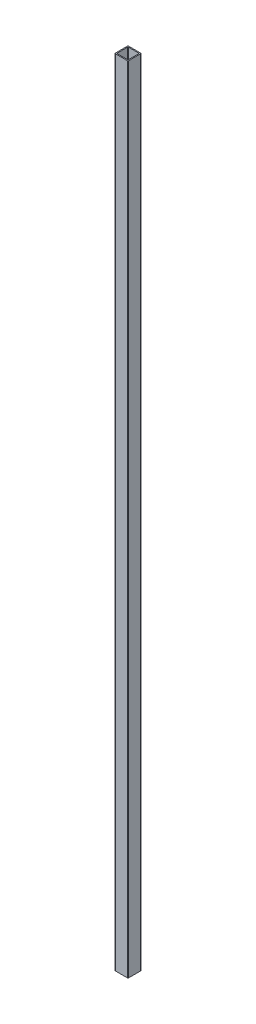
ISO-10303-21;
HEADER;
FILE_DESCRIPTION(('STEP AP214'),'2;1');
FILE_NAME('part.step','',(''),(''),'','','');
FILE_SCHEMA(('AUTOMOTIVE_DESIGN { 1 0 10303 214 1 1 1 1 }'));
ENDSEC;
DATA;
#1=APPLICATION_CONTEXT('core data for automotive mechanical design processes');
#2=APPLICATION_PROTOCOL_DEFINITION('international standard','automotive_design',2000,#1);
#3=PRODUCT_CONTEXT('',#1,'mechanical');
#4=PRODUCT('Part','Part','',(#3));
#5=PRODUCT_RELATED_PRODUCT_CATEGORY('part','',(#4));
#6=PRODUCT_DEFINITION_FORMATION('','',#4);
#7=PRODUCT_DEFINITION_CONTEXT('part definition',#1,'design');
#8=PRODUCT_DEFINITION('design','',#6,#7);
#9=PRODUCT_DEFINITION_SHAPE('','',#8);
#10=(LENGTH_UNIT() NAMED_UNIT(*) SI_UNIT(.MILLI.,.METRE.));
#11=(NAMED_UNIT(*) PLANE_ANGLE_UNIT() SI_UNIT($,.RADIAN.));
#12=(NAMED_UNIT(*) SI_UNIT($,.STERADIAN.) SOLID_ANGLE_UNIT());
#13=UNCERTAINTY_MEASURE_WITH_UNIT(LENGTH_MEASURE(1.E-05),#10,'distance_accuracy_value','');
#14=(GEOMETRIC_REPRESENTATION_CONTEXT(3) GLOBAL_UNCERTAINTY_ASSIGNED_CONTEXT((#13)) GLOBAL_UNIT_ASSIGNED_CONTEXT((#10,
#11,#12)) REPRESENTATION_CONTEXT('',''));
#15=CARTESIAN_POINT('',(0.,0.,0.));
#16=DIRECTION('',(0.,0.,1.));
#17=DIRECTION('',(1.,0.,0.));
#18=AXIS2_PLACEMENT_3D('',#15,#16,#17);
#19=CARTESIAN_POINT('',(-9.,1200.,9.));
#20=DIRECTION('',(0.,-1.,0.));
#21=DIRECTION('',(0.,0.,-1.));
#22=AXIS2_PLACEMENT_3D('',#19,#20,#21);
#23=PLANE('',#22);
#24=CARTESIAN_POINT('',(-9.,1200.,9.));
#25=DIRECTION('',(0.,1.,0.));
#26=DIRECTION('',(0.,0.,-1.));
#27=AXIS2_PLACEMENT_3D('',#24,#25,#26);
#28=CIRCLE('',#27,0.999999999999999);
#29=CARTESIAN_POINT('',(-10.,1200.,8.99999999999999));
#30=VERTEX_POINT('',#29);
#31=CARTESIAN_POINT('',(-8.99999999999999,1200.,10.));
#32=VERTEX_POINT('',#31);
#33=EDGE_CURVE('E213',#30,#32,#28,.T.);
#34=ORIENTED_EDGE('',*,*,#33,.T.);
#35=DIRECTION('',(1.,0.,0.));
#36=VECTOR('',#35,1.);
#37=CARTESIAN_POINT('',(-8.99999999999999,1200.,10.));
#38=LINE('',#37,#36);
#39=CARTESIAN_POINT('',(8.99999999999999,1200.,10.));
#40=VERTEX_POINT('',#39);
#41=EDGE_CURVE('E216',#32,#40,#38,.T.);
#42=ORIENTED_EDGE('',*,*,#41,.T.);
#43=CARTESIAN_POINT('',(9.,1200.,9.));
#44=DIRECTION('',(0.,1.,0.));
#45=DIRECTION('',(0.,0.,1.));
#46=AXIS2_PLACEMENT_3D('',#43,#44,#45);
#47=CIRCLE('',#46,0.999999999999999);
#48=CARTESIAN_POINT('',(10.,1200.,8.99999999999999));
#49=VERTEX_POINT('',#48);
#50=EDGE_CURVE('E219',#40,#49,#47,.T.);
#51=ORIENTED_EDGE('',*,*,#50,.T.);
#52=DIRECTION('',(0.,0.,-1.));
#53=VECTOR('',#52,1.);
#54=CARTESIAN_POINT('',(10.,1200.,8.99999999999999));
#55=LINE('',#54,#53);
#56=CARTESIAN_POINT('',(10.,1200.,-8.99999999999999));
#57=VERTEX_POINT('',#56);
#58=EDGE_CURVE('E221',#49,#57,#55,.T.);
#59=ORIENTED_EDGE('',*,*,#58,.T.);
#60=CARTESIAN_POINT('',(9.,1200.,-9.));
#61=DIRECTION('',(0.,1.,0.));
#62=DIRECTION('',(0.,0.,-1.));
#63=AXIS2_PLACEMENT_3D('',#60,#61,#62);
#64=CIRCLE('',#63,0.999999999999999);
#65=CARTESIAN_POINT('',(8.99999999999999,1200.,-10.));
#66=VERTEX_POINT('',#65);
#67=EDGE_CURVE('E223',#57,#66,#64,.T.);
#68=ORIENTED_EDGE('',*,*,#67,.T.);
#69=DIRECTION('',(-1.,0.,0.));
#70=VECTOR('',#69,1.);
#71=CARTESIAN_POINT('',(-8.99999999999999,1200.,-10.));
#72=LINE('',#71,#70);
#73=CARTESIAN_POINT('',(-8.99999999999999,1200.,-10.));
#74=VERTEX_POINT('',#73);
#75=EDGE_CURVE('E225',#66,#74,#72,.T.);
#76=ORIENTED_EDGE('',*,*,#75,.T.);
#77=CARTESIAN_POINT('',(-9.,1200.,-9.));
#78=DIRECTION('',(0.,1.,0.));
#79=DIRECTION('',(0.,0.,-1.));
#80=AXIS2_PLACEMENT_3D('',#77,#78,#79);
#81=CIRCLE('',#80,0.999999999999999);
#82=CARTESIAN_POINT('',(-10.,1200.,-8.99999999999999));
#83=VERTEX_POINT('',#82);
#84=EDGE_CURVE('E227',#74,#83,#81,.T.);
#85=ORIENTED_EDGE('',*,*,#84,.T.);
#86=DIRECTION('',(0.,0.,1.));
#87=VECTOR('',#86,1.);
#88=CARTESIAN_POINT('',(-10.,1200.,8.99999999999999));
#89=LINE('',#88,#87);
#90=EDGE_CURVE('E229',#83,#30,#89,.T.);
#91=ORIENTED_EDGE('',*,*,#90,.T.);
#92=EDGE_LOOP('',(#34,#42,#51,#59,#68,#76,#85,#91));
#93=FACE_BOUND('',#92,.T.);
#94=CARTESIAN_POINT('',(-7.5,1200.,7.5));
#95=DIRECTION('',(0.,1.,0.));
#96=DIRECTION('',(0.,0.,-1.));
#97=AXIS2_PLACEMENT_3D('',#94,#95,#96);
#98=CIRCLE('',#97,1.);
#99=CARTESIAN_POINT('',(-8.5,1200.,7.49999999999999));
#100=VERTEX_POINT('',#99);
#101=CARTESIAN_POINT('',(-7.5,1200.,8.5));
#102=VERTEX_POINT('',#101);
#103=EDGE_CURVE('E148',#100,#102,#98,.T.);
#104=ORIENTED_EDGE('',*,*,#103,.F.);
#105=DIRECTION('',(0.,0.,1.));
#106=VECTOR('',#105,1.);
#107=CARTESIAN_POINT('',(-8.5,1200.,7.49999999999999));
#108=LINE('',#107,#106);
#109=CARTESIAN_POINT('',(-8.5,1200.,-7.49999999999999));
#110=VERTEX_POINT('',#109);
#111=EDGE_CURVE('E181',#110,#100,#108,.T.);
#112=ORIENTED_EDGE('',*,*,#111,.F.);
#113=CARTESIAN_POINT('',(-7.5,1200.,-7.5));
#114=DIRECTION('',(0.,1.,0.));
#115=DIRECTION('',(0.,0.,-1.));
#116=AXIS2_PLACEMENT_3D('',#113,#114,#115);
#117=CIRCLE('',#116,1.);
#118=CARTESIAN_POINT('',(-7.5,1200.,-8.5));
#119=VERTEX_POINT('',#118);
#120=EDGE_CURVE('E179',#119,#110,#117,.T.);
#121=ORIENTED_EDGE('',*,*,#120,.F.);
#122=DIRECTION('',(-1.,0.,0.));
#123=VECTOR('',#122,1.);
#124=CARTESIAN_POINT('',(-7.5,1200.,-8.5));
#125=LINE('',#124,#123);
#126=CARTESIAN_POINT('',(7.49999999999999,1200.,-8.5));
#127=VERTEX_POINT('',#126);
#128=EDGE_CURVE('E177',#127,#119,#125,.T.);
#129=ORIENTED_EDGE('',*,*,#128,.F.);
#130=CARTESIAN_POINT('',(7.5,1200.,-7.5));
#131=DIRECTION('',(0.,1.,0.));
#132=DIRECTION('',(0.,0.,-1.));
#133=AXIS2_PLACEMENT_3D('',#130,#131,#132);
#134=CIRCLE('',#133,1.);
#135=CARTESIAN_POINT('',(8.5,1200.,-7.49999999999999));
#136=VERTEX_POINT('',#135);
#137=EDGE_CURVE('E175',#136,#127,#134,.T.);
#138=ORIENTED_EDGE('',*,*,#137,.F.);
#139=DIRECTION('',(0.,0.,-1.));
#140=VECTOR('',#139,1.);
#141=CARTESIAN_POINT('',(8.5,1200.,7.49999999999999));
#142=LINE('',#141,#140);
#143=CARTESIAN_POINT('',(8.5,1200.,7.49999999999999));
#144=VERTEX_POINT('',#143);
#145=EDGE_CURVE('E171',#144,#136,#142,.T.);
#146=ORIENTED_EDGE('',*,*,#145,.F.);
#147=CARTESIAN_POINT('',(7.5,1200.,7.5));
#148=DIRECTION('',(0.,1.,0.));
#149=DIRECTION('',(0.,0.,1.));
#150=AXIS2_PLACEMENT_3D('',#147,#148,#149);
#151=CIRCLE('',#150,1.);
#152=CARTESIAN_POINT('',(7.49999999999999,1200.,8.5));
#153=VERTEX_POINT('',#152);
#154=EDGE_CURVE('E169',#153,#144,#151,.T.);
#155=ORIENTED_EDGE('',*,*,#154,.F.);
#156=DIRECTION('',(1.,0.,0.));
#157=VECTOR('',#156,1.);
#158=CARTESIAN_POINT('',(-7.5,1200.,8.5));
#159=LINE('',#158,#157);
#160=EDGE_CURVE('E156',#102,#153,#159,.T.);
#161=ORIENTED_EDGE('',*,*,#160,.F.);
#162=EDGE_LOOP('',(#104,#112,#121,#129,#138,#146,#155,#161));
#163=FACE_BOUND('',#162,.T.);
#164=ADVANCED_FACE('F35',(#93,#163),#23,.F.);
#165=CARTESIAN_POINT('',(-9.,0.,9.));
#166=DIRECTION('',(0.,-1.,0.));
#167=DIRECTION('',(0.,0.,-1.));
#168=AXIS2_PLACEMENT_3D('',#165,#166,#167);
#169=PLANE('',#168);
#170=CARTESIAN_POINT('',(-9.,0.,9.));
#171=DIRECTION('',(0.,1.,0.));
#172=DIRECTION('',(0.,0.,-1.));
#173=AXIS2_PLACEMENT_3D('',#170,#171,#172);
#174=CIRCLE('',#173,0.999999999999999);
#175=CARTESIAN_POINT('',(-10.,0.,8.99999999999999));
#176=VERTEX_POINT('',#175);
#177=CARTESIAN_POINT('',(-8.99999999999999,0.,10.));
#178=VERTEX_POINT('',#177);
#179=EDGE_CURVE('E164',#176,#178,#174,.T.);
#180=ORIENTED_EDGE('',*,*,#179,.F.);
#181=DIRECTION('',(0.,0.,1.));
#182=VECTOR('',#181,1.);
#183=CARTESIAN_POINT('',(-10.,0.,8.99999999999999));
#184=LINE('',#183,#182);
#185=CARTESIAN_POINT('',(-10.,0.,-8.99999999999999));
#186=VERTEX_POINT('',#185);
#187=EDGE_CURVE('E217',#186,#176,#184,.T.);
#188=ORIENTED_EDGE('',*,*,#187,.F.);
#189=CARTESIAN_POINT('',(-9.,0.,-9.));
#190=DIRECTION('',(0.,1.,0.));
#191=DIRECTION('',(0.,0.,-1.));
#192=AXIS2_PLACEMENT_3D('',#189,#190,#191);
#193=CIRCLE('',#192,0.999999999999999);
#194=CARTESIAN_POINT('',(-8.99999999999999,0.,-10.));
#195=VERTEX_POINT('',#194);
#196=EDGE_CURVE('E244',#195,#186,#193,.T.);
#197=ORIENTED_EDGE('',*,*,#196,.F.);
#198=DIRECTION('',(-1.,0.,0.));
#199=VECTOR('',#198,1.);
#200=CARTESIAN_POINT('',(-8.99999999999999,0.,-10.));
#201=LINE('',#200,#199);
#202=CARTESIAN_POINT('',(8.99999999999999,0.,-10.));
#203=VERTEX_POINT('',#202);
#204=EDGE_CURVE('E242',#203,#195,#201,.T.);
#205=ORIENTED_EDGE('',*,*,#204,.F.);
#206=CARTESIAN_POINT('',(9.,0.,-9.));
#207=DIRECTION('',(0.,1.,0.));
#208=DIRECTION('',(0.,0.,-1.));
#209=AXIS2_PLACEMENT_3D('',#206,#207,#208);
#210=CIRCLE('',#209,0.999999999999999);
#211=CARTESIAN_POINT('',(10.,0.,-8.99999999999999));
#212=VERTEX_POINT('',#211);
#213=EDGE_CURVE('E240',#212,#203,#210,.T.);
#214=ORIENTED_EDGE('',*,*,#213,.F.);
#215=DIRECTION('',(0.,0.,-1.));
#216=VECTOR('',#215,1.);
#217=CARTESIAN_POINT('',(10.,0.,8.99999999999999));
#218=LINE('',#217,#216);
#219=CARTESIAN_POINT('',(10.,0.,8.99999999999999));
#220=VERTEX_POINT('',#219);
#221=EDGE_CURVE('E238',#220,#212,#218,.T.);
#222=ORIENTED_EDGE('',*,*,#221,.F.);
#223=CARTESIAN_POINT('',(9.,0.,9.));
#224=DIRECTION('',(0.,1.,0.));
#225=DIRECTION('',(0.,0.,1.));
#226=AXIS2_PLACEMENT_3D('',#223,#224,#225);
#227=CIRCLE('',#226,0.999999999999999);
#228=CARTESIAN_POINT('',(8.99999999999999,0.,10.));
#229=VERTEX_POINT('',#228);
#230=EDGE_CURVE('E236',#229,#220,#227,.T.);
#231=ORIENTED_EDGE('',*,*,#230,.F.);
#232=DIRECTION('',(1.,0.,0.));
#233=VECTOR('',#232,1.);
#234=CARTESIAN_POINT('',(-8.99999999999999,0.,10.));
#235=LINE('',#234,#233);
#236=EDGE_CURVE('E234',#178,#229,#235,.T.);
#237=ORIENTED_EDGE('',*,*,#236,.F.);
#238=EDGE_LOOP('',(#180,#188,#197,#205,#214,#222,#231,#237));
#239=FACE_BOUND('',#238,.T.);
#240=DIRECTION('',(0.,0.,1.));
#241=VECTOR('',#240,1.);
#242=CARTESIAN_POINT('',(-8.5,0.,7.49999999999999));
#243=LINE('',#242,#241);
#244=CARTESIAN_POINT('',(-8.5,0.,-7.49999999999999));
#245=VERTEX_POINT('',#244);
#246=CARTESIAN_POINT('',(-8.5,0.,7.49999999999999));
#247=VERTEX_POINT('',#246);
#248=EDGE_CURVE('E157',#245,#247,#243,.T.);
#249=ORIENTED_EDGE('',*,*,#248,.T.);
#250=CARTESIAN_POINT('',(-7.5,0.,7.5));
#251=DIRECTION('',(0.,1.,0.));
#252=DIRECTION('',(0.,0.,-1.));
#253=AXIS2_PLACEMENT_3D('',#250,#251,#252);
#254=CIRCLE('',#253,1.);
#255=CARTESIAN_POINT('',(-7.5,0.,8.5));
#256=VERTEX_POINT('',#255);
#257=EDGE_CURVE('E58',#247,#256,#254,.T.);
#258=ORIENTED_EDGE('',*,*,#257,.T.);
#259=DIRECTION('',(1.,0.,0.));
#260=VECTOR('',#259,1.);
#261=CARTESIAN_POINT('',(-7.5,0.,8.5));
#262=LINE('',#261,#260);
#263=CARTESIAN_POINT('',(7.49999999999999,0.,8.5));
#264=VERTEX_POINT('',#263);
#265=EDGE_CURVE('E163',#256,#264,#262,.T.);
#266=ORIENTED_EDGE('',*,*,#265,.T.);
#267=CARTESIAN_POINT('',(7.5,0.,7.5));
#268=DIRECTION('',(0.,1.,0.));
#269=DIRECTION('',(0.,0.,1.));
#270=AXIS2_PLACEMENT_3D('',#267,#268,#269);
#271=CIRCLE('',#270,1.);
#272=CARTESIAN_POINT('',(8.5,0.,7.49999999999999));
#273=VERTEX_POINT('',#272);
#274=EDGE_CURVE('E185',#264,#273,#271,.T.);
#275=ORIENTED_EDGE('',*,*,#274,.T.);
#276=DIRECTION('',(0.,0.,-1.));
#277=VECTOR('',#276,1.);
#278=CARTESIAN_POINT('',(8.5,0.,7.49999999999999));
#279=LINE('',#278,#277);
#280=CARTESIAN_POINT('',(8.5,0.,-7.49999999999999));
#281=VERTEX_POINT('',#280);
#282=EDGE_CURVE('E188',#273,#281,#279,.T.);
#283=ORIENTED_EDGE('',*,*,#282,.T.);
#284=CARTESIAN_POINT('',(7.5,0.,-7.5));
#285=DIRECTION('',(0.,1.,0.));
#286=DIRECTION('',(0.,0.,-1.));
#287=AXIS2_PLACEMENT_3D('',#284,#285,#286);
#288=CIRCLE('',#287,1.);
#289=CARTESIAN_POINT('',(7.49999999999999,0.,-8.5));
#290=VERTEX_POINT('',#289);
#291=EDGE_CURVE('E191',#281,#290,#288,.T.);
#292=ORIENTED_EDGE('',*,*,#291,.T.);
#293=DIRECTION('',(-1.,0.,0.));
#294=VECTOR('',#293,1.);
#295=CARTESIAN_POINT('',(-7.5,0.,-8.5));
#296=LINE('',#295,#294);
#297=CARTESIAN_POINT('',(-7.5,0.,-8.5));
#298=VERTEX_POINT('',#297);
#299=EDGE_CURVE('E194',#290,#298,#296,.T.);
#300=ORIENTED_EDGE('',*,*,#299,.T.);
#301=CARTESIAN_POINT('',(-7.5,0.,-7.5));
#302=DIRECTION('',(0.,1.,0.));
#303=DIRECTION('',(0.,0.,-1.));
#304=AXIS2_PLACEMENT_3D('',#301,#302,#303);
#305=CIRCLE('',#304,1.);
#306=EDGE_CURVE('E197',#298,#245,#305,.T.);
#307=ORIENTED_EDGE('',*,*,#306,.T.);
#308=EDGE_LOOP('',(#249,#258,#266,#275,#283,#292,#300,#307));
#309=FACE_BOUND('',#308,.T.);
#310=ADVANCED_FACE('F274',(#239,#309),#169,.T.);
#311=CARTESIAN_POINT('',(-9.,1200.,9.));
#312=DIRECTION('',(0.,-1.,0.));
#313=DIRECTION('',(0.,0.,-1.));
#314=AXIS2_PLACEMENT_3D('',#311,#312,#313);
#315=CYLINDRICAL_SURFACE('',#314,0.999999999999999);
#316=ORIENTED_EDGE('',*,*,#179,.T.);
#317=DIRECTION('',(0.,-1.,0.));
#318=VECTOR('',#317,1.);
#319=CARTESIAN_POINT('',(-8.99999999999999,1200.,10.));
#320=LINE('',#319,#318);
#321=EDGE_CURVE('E11',#32,#178,#320,.T.);
#322=ORIENTED_EDGE('',*,*,#321,.F.);
#323=ORIENTED_EDGE('',*,*,#33,.F.);
#324=DIRECTION('',(0.,-1.,0.));
#325=VECTOR('',#324,1.);
#326=CARTESIAN_POINT('',(-10.,1200.,8.99999999999999));
#327=LINE('',#326,#325);
#328=EDGE_CURVE('E231',#30,#176,#327,.T.);
#329=ORIENTED_EDGE('',*,*,#328,.T.);
#330=EDGE_LOOP('',(#316,#322,#323,#329));
#331=FACE_BOUND('',#330,.T.);
#332=ADVANCED_FACE('F37',(#331),#315,.T.);
#333=CARTESIAN_POINT('',(-8.99999999999999,1200.,10.));
#334=DIRECTION('',(0.,0.,-1.));
#335=DIRECTION('',(-1.,0.,0.));
#336=AXIS2_PLACEMENT_3D('',#333,#334,#335);
#337=PLANE('',#336);
#338=ORIENTED_EDGE('',*,*,#236,.T.);
#339=DIRECTION('',(0.,-1.,0.));
#340=VECTOR('',#339,1.);
#341=CARTESIAN_POINT('',(8.99999999999999,1200.,10.));
#342=LINE('',#341,#340);
#343=EDGE_CURVE('E43',#40,#229,#342,.T.);
#344=ORIENTED_EDGE('',*,*,#343,.F.);
#345=ORIENTED_EDGE('',*,*,#41,.F.);
#346=ORIENTED_EDGE('',*,*,#321,.T.);
#347=EDGE_LOOP('',(#338,#344,#345,#346));
#348=FACE_BOUND('',#347,.T.);
#349=ADVANCED_FACE('F291',(#348),#337,.F.);
#350=CARTESIAN_POINT('',(9.,1200.,9.));
#351=DIRECTION('',(0.,-1.,0.));
#352=DIRECTION('',(0.,0.,-1.));
#353=AXIS2_PLACEMENT_3D('',#350,#351,#352);
#354=CYLINDRICAL_SURFACE('',#353,0.999999999999999);
#355=ORIENTED_EDGE('',*,*,#230,.T.);
#356=DIRECTION('',(0.,-1.,0.));
#357=VECTOR('',#356,1.);
#358=CARTESIAN_POINT('',(10.,1200.,8.99999999999999));
#359=LINE('',#358,#357);
#360=EDGE_CURVE('E261',#49,#220,#359,.T.);
#361=ORIENTED_EDGE('',*,*,#360,.F.);
#362=ORIENTED_EDGE('',*,*,#50,.F.);
#363=ORIENTED_EDGE('',*,*,#343,.T.);
#364=EDGE_LOOP('',(#355,#361,#362,#363));
#365=FACE_BOUND('',#364,.T.);
#366=ADVANCED_FACE('F268',(#365),#354,.T.);
#367=CARTESIAN_POINT('',(10.,1200.,8.99999999999999));
#368=DIRECTION('',(-1.,0.,0.));
#369=DIRECTION('',(0.,0.,1.));
#370=AXIS2_PLACEMENT_3D('',#367,#368,#369);
#371=PLANE('',#370);
#372=ORIENTED_EDGE('',*,*,#221,.T.);
#373=DIRECTION('',(0.,-1.,0.));
#374=VECTOR('',#373,1.);
#375=CARTESIAN_POINT('',(10.,1200.,-8.99999999999999));
#376=LINE('',#375,#374);
#377=EDGE_CURVE('E258',#57,#212,#376,.T.);
#378=ORIENTED_EDGE('',*,*,#377,.F.);
#379=ORIENTED_EDGE('',*,*,#58,.F.);
#380=ORIENTED_EDGE('',*,*,#360,.T.);
#381=EDGE_LOOP('',(#372,#378,#379,#380));
#382=FACE_BOUND('',#381,.T.);
#383=ADVANCED_FACE('F280',(#382),#371,.F.);
#384=CARTESIAN_POINT('',(9.,1200.,-9.));
#385=DIRECTION('',(0.,-1.,0.));
#386=DIRECTION('',(0.,0.,-1.));
#387=AXIS2_PLACEMENT_3D('',#384,#385,#386);
#388=CYLINDRICAL_SURFACE('',#387,0.999999999999999);
#389=ORIENTED_EDGE('',*,*,#213,.T.);
#390=DIRECTION('',(0.,-1.,0.));
#391=VECTOR('',#390,1.);
#392=CARTESIAN_POINT('',(8.99999999999999,1200.,-10.));
#393=LINE('',#392,#391);
#394=EDGE_CURVE('E255',#66,#203,#393,.T.);
#395=ORIENTED_EDGE('',*,*,#394,.F.);
#396=ORIENTED_EDGE('',*,*,#67,.F.);
#397=ORIENTED_EDGE('',*,*,#377,.T.);
#398=EDGE_LOOP('',(#389,#395,#396,#397));
#399=FACE_BOUND('',#398,.T.);
#400=ADVANCED_FACE('F284',(#399),#388,.T.);
#401=CARTESIAN_POINT('',(-8.99999999999999,1200.,-10.));
#402=DIRECTION('',(0.,0.,1.));
#403=DIRECTION('',(1.,0.,0.));
#404=AXIS2_PLACEMENT_3D('',#401,#402,#403);
#405=PLANE('',#404);
#406=ORIENTED_EDGE('',*,*,#204,.T.);
#407=DIRECTION('',(0.,-1.,0.));
#408=VECTOR('',#407,1.);
#409=CARTESIAN_POINT('',(-8.99999999999999,1200.,-10.));
#410=LINE('',#409,#408);
#411=EDGE_CURVE('E252',#74,#195,#410,.T.);
#412=ORIENTED_EDGE('',*,*,#411,.F.);
#413=ORIENTED_EDGE('',*,*,#75,.F.);
#414=ORIENTED_EDGE('',*,*,#394,.T.);
#415=EDGE_LOOP('',(#406,#412,#413,#414));
#416=FACE_BOUND('',#415,.T.);
#417=ADVANCED_FACE('F304',(#416),#405,.F.);
#418=CARTESIAN_POINT('',(-9.,1200.,-9.));
#419=DIRECTION('',(0.,-1.,0.));
#420=DIRECTION('',(0.,0.,-1.));
#421=AXIS2_PLACEMENT_3D('',#418,#419,#420);
#422=CYLINDRICAL_SURFACE('',#421,0.999999999999999);
#423=ORIENTED_EDGE('',*,*,#196,.T.);
#424=DIRECTION('',(0.,-1.,0.));
#425=VECTOR('',#424,1.);
#426=CARTESIAN_POINT('',(-10.,1200.,-8.99999999999999));
#427=LINE('',#426,#425);
#428=EDGE_CURVE('E249',#83,#186,#427,.T.);
#429=ORIENTED_EDGE('',*,*,#428,.F.);
#430=ORIENTED_EDGE('',*,*,#84,.F.);
#431=ORIENTED_EDGE('',*,*,#411,.T.);
#432=EDGE_LOOP('',(#423,#429,#430,#431));
#433=FACE_BOUND('',#432,.T.);
#434=ADVANCED_FACE('F302',(#433),#422,.T.);
#435=CARTESIAN_POINT('',(-10.,1200.,8.99999999999999));
#436=DIRECTION('',(1.,0.,0.));
#437=DIRECTION('',(0.,0.,-1.));
#438=AXIS2_PLACEMENT_3D('',#435,#436,#437);
#439=PLANE('',#438);
#440=ORIENTED_EDGE('',*,*,#187,.T.);
#441=ORIENTED_EDGE('',*,*,#328,.F.);
#442=ORIENTED_EDGE('',*,*,#90,.F.);
#443=ORIENTED_EDGE('',*,*,#428,.T.);
#444=EDGE_LOOP('',(#440,#441,#442,#443));
#445=FACE_BOUND('',#444,.T.);
#446=ADVANCED_FACE('F297',(#445),#439,.F.);
#447=CARTESIAN_POINT('',(-7.5,1200.,7.5));
#448=DIRECTION('',(0.,-1.,0.));
#449=DIRECTION('',(0.,0.,-1.));
#450=AXIS2_PLACEMENT_3D('',#447,#448,#449);
#451=CYLINDRICAL_SURFACE('',#450,1.);
#452=ORIENTED_EDGE('',*,*,#257,.F.);
#453=DIRECTION('',(0.,-1.,0.));
#454=VECTOR('',#453,1.);
#455=CARTESIAN_POINT('',(-8.5,1200.,7.49999999999999));
#456=LINE('',#455,#454);
#457=EDGE_CURVE('E152',#100,#247,#456,.T.);
#458=ORIENTED_EDGE('',*,*,#457,.F.);
#459=ORIENTED_EDGE('',*,*,#103,.T.);
#460=DIRECTION('',(0.,-1.,0.));
#461=VECTOR('',#460,1.);
#462=CARTESIAN_POINT('',(-7.5,1200.,8.5));
#463=LINE('',#462,#461);
#464=EDGE_CURVE('E151',#102,#256,#463,.T.);
#465=ORIENTED_EDGE('',*,*,#464,.T.);
#466=EDGE_LOOP('',(#452,#458,#459,#465));
#467=FACE_BOUND('',#466,.T.);
#468=ADVANCED_FACE('F150',(#467),#451,.F.);
#469=CARTESIAN_POINT('',(-7.5,1200.,8.5));
#470=DIRECTION('',(0.,0.,-1.));
#471=DIRECTION('',(-1.,0.,0.));
#472=AXIS2_PLACEMENT_3D('',#469,#470,#471);
#473=PLANE('',#472);
#474=ORIENTED_EDGE('',*,*,#265,.F.);
#475=ORIENTED_EDGE('',*,*,#464,.F.);
#476=ORIENTED_EDGE('',*,*,#160,.T.);
#477=DIRECTION('',(0.,-1.,0.));
#478=VECTOR('',#477,1.);
#479=CARTESIAN_POINT('',(7.49999999999999,1200.,8.5));
#480=LINE('',#479,#478);
#481=EDGE_CURVE('E165',#153,#264,#480,.T.);
#482=ORIENTED_EDGE('',*,*,#481,.T.);
#483=EDGE_LOOP('',(#474,#475,#476,#482));
#484=FACE_BOUND('',#483,.T.);
#485=ADVANCED_FACE('F160',(#484),#473,.T.);
#486=CARTESIAN_POINT('',(7.5,1200.,7.5));
#487=DIRECTION('',(0.,-1.,0.));
#488=DIRECTION('',(0.,0.,-1.));
#489=AXIS2_PLACEMENT_3D('',#486,#487,#488);
#490=CYLINDRICAL_SURFACE('',#489,1.);
#491=ORIENTED_EDGE('',*,*,#274,.F.);
#492=ORIENTED_EDGE('',*,*,#481,.F.);
#493=ORIENTED_EDGE('',*,*,#154,.T.);
#494=DIRECTION('',(0.,-1.,0.));
#495=VECTOR('',#494,1.);
#496=CARTESIAN_POINT('',(8.5,1200.,7.49999999999999));
#497=LINE('',#496,#495);
#498=EDGE_CURVE('E210',#144,#273,#497,.T.);
#499=ORIENTED_EDGE('',*,*,#498,.T.);
#500=EDGE_LOOP('',(#491,#492,#493,#499));
#501=FACE_BOUND('',#500,.T.);
#502=ADVANCED_FACE('F329',(#501),#490,.F.);
#503=CARTESIAN_POINT('',(8.5,1200.,7.49999999999999));
#504=DIRECTION('',(-1.,0.,0.));
#505=DIRECTION('',(0.,0.,1.));
#506=AXIS2_PLACEMENT_3D('',#503,#504,#505);
#507=PLANE('',#506);
#508=ORIENTED_EDGE('',*,*,#282,.F.);
#509=ORIENTED_EDGE('',*,*,#498,.F.);
#510=ORIENTED_EDGE('',*,*,#145,.T.);
#511=DIRECTION('',(0.,-1.,0.));
#512=VECTOR('',#511,1.);
#513=CARTESIAN_POINT('',(8.5,1200.,-7.49999999999999));
#514=LINE('',#513,#512);
#515=EDGE_CURVE('E208',#136,#281,#514,.T.);
#516=ORIENTED_EDGE('',*,*,#515,.T.);
#517=EDGE_LOOP('',(#508,#509,#510,#516));
#518=FACE_BOUND('',#517,.T.);
#519=ADVANCED_FACE('F333',(#518),#507,.T.);
#520=CARTESIAN_POINT('',(7.5,1200.,-7.5));
#521=DIRECTION('',(0.,-1.,0.));
#522=DIRECTION('',(0.,0.,-1.));
#523=AXIS2_PLACEMENT_3D('',#520,#521,#522);
#524=CYLINDRICAL_SURFACE('',#523,1.);
#525=ORIENTED_EDGE('',*,*,#291,.F.);
#526=ORIENTED_EDGE('',*,*,#515,.F.);
#527=ORIENTED_EDGE('',*,*,#137,.T.);
#528=DIRECTION('',(0.,-1.,0.));
#529=VECTOR('',#528,1.);
#530=CARTESIAN_POINT('',(7.49999999999999,1200.,-8.5));
#531=LINE('',#530,#529);
#532=EDGE_CURVE('E206',#127,#290,#531,.T.);
#533=ORIENTED_EDGE('',*,*,#532,.T.);
#534=EDGE_LOOP('',(#525,#526,#527,#533));
#535=FACE_BOUND('',#534,.T.);
#536=ADVANCED_FACE('F339',(#535),#524,.F.);
#537=CARTESIAN_POINT('',(-7.5,1200.,-8.5));
#538=DIRECTION('',(0.,0.,1.));
#539=DIRECTION('',(1.,0.,0.));
#540=AXIS2_PLACEMENT_3D('',#537,#538,#539);
#541=PLANE('',#540);
#542=ORIENTED_EDGE('',*,*,#299,.F.);
#543=ORIENTED_EDGE('',*,*,#532,.F.);
#544=ORIENTED_EDGE('',*,*,#128,.T.);
#545=DIRECTION('',(0.,-1.,0.));
#546=VECTOR('',#545,1.);
#547=CARTESIAN_POINT('',(-7.5,1200.,-8.5));
#548=LINE('',#547,#546);
#549=EDGE_CURVE('E204',#119,#298,#548,.T.);
#550=ORIENTED_EDGE('',*,*,#549,.T.);
#551=EDGE_LOOP('',(#542,#543,#544,#550));
#552=FACE_BOUND('',#551,.T.);
#553=ADVANCED_FACE('F343',(#552),#541,.T.);
#554=CARTESIAN_POINT('',(-7.5,1200.,-7.5));
#555=DIRECTION('',(0.,-1.,0.));
#556=DIRECTION('',(0.,0.,-1.));
#557=AXIS2_PLACEMENT_3D('',#554,#555,#556);
#558=CYLINDRICAL_SURFACE('',#557,1.);
#559=ORIENTED_EDGE('',*,*,#306,.F.);
#560=ORIENTED_EDGE('',*,*,#549,.F.);
#561=ORIENTED_EDGE('',*,*,#120,.T.);
#562=DIRECTION('',(0.,-1.,0.));
#563=VECTOR('',#562,1.);
#564=CARTESIAN_POINT('',(-8.5,1200.,-7.49999999999999));
#565=LINE('',#564,#563);
#566=EDGE_CURVE('E50',#110,#245,#565,.T.);
#567=ORIENTED_EDGE('',*,*,#566,.T.);
#568=EDGE_LOOP('',(#559,#560,#561,#567));
#569=FACE_BOUND('',#568,.T.);
#570=ADVANCED_FACE('F347',(#569),#558,.F.);
#571=CARTESIAN_POINT('',(-8.5,1200.,7.49999999999999));
#572=DIRECTION('',(1.,0.,0.));
#573=DIRECTION('',(0.,0.,-1.));
#574=AXIS2_PLACEMENT_3D('',#571,#572,#573);
#575=PLANE('',#574);
#576=ORIENTED_EDGE('',*,*,#248,.F.);
#577=ORIENTED_EDGE('',*,*,#566,.F.);
#578=ORIENTED_EDGE('',*,*,#111,.T.);
#579=ORIENTED_EDGE('',*,*,#457,.T.);
#580=EDGE_LOOP('',(#576,#577,#578,#579));
#581=FACE_BOUND('',#580,.T.);
#582=ADVANCED_FACE('F351',(#581),#575,.T.);
#583=CLOSED_SHELL('',(#164,#310,#332,#349,#366,#383,#400,#417,#434,#446,#468,#485,#502,#519,
#536,#553,#570,#582));
#584=MANIFOLD_SOLID_BREP('B2',#583);
#585=ADVANCED_BREP_SHAPE_REPRESENTATION('',(#18,#584),#14);
#586=SHAPE_DEFINITION_REPRESENTATION(#9,#585);
ENDSEC;
END-ISO-10303-21;
